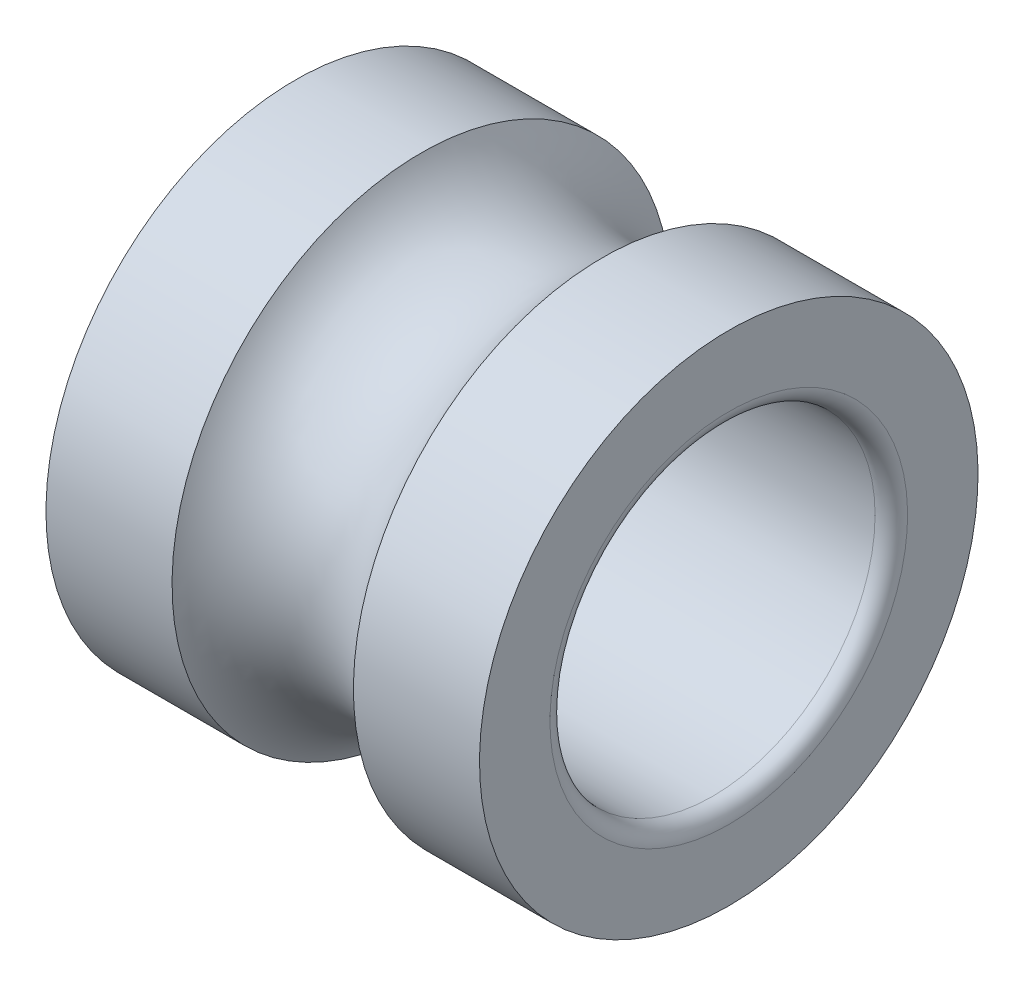
ISO-10303-21;
HEADER;
FILE_DESCRIPTION(('STEP AP214'),'2;1');
FILE_NAME('part.step','',(''),(''),'','','');
FILE_SCHEMA(('AUTOMOTIVE_DESIGN { 1 0 10303 214 1 1 1 1 }'));
ENDSEC;
DATA;
#1=APPLICATION_CONTEXT('core data for automotive mechanical design processes');
#2=APPLICATION_PROTOCOL_DEFINITION('international standard','automotive_design',2000,#1);
#3=PRODUCT_CONTEXT('',#1,'mechanical');
#4=PRODUCT('Part','Part','',(#3));
#5=PRODUCT_RELATED_PRODUCT_CATEGORY('part','',(#4));
#6=PRODUCT_DEFINITION_FORMATION('','',#4);
#7=PRODUCT_DEFINITION_CONTEXT('part definition',#1,'design');
#8=PRODUCT_DEFINITION('design','',#6,#7);
#9=PRODUCT_DEFINITION_SHAPE('','',#8);
#10=(LENGTH_UNIT() NAMED_UNIT(*) SI_UNIT(.MILLI.,.METRE.));
#11=(NAMED_UNIT(*) PLANE_ANGLE_UNIT() SI_UNIT($,.RADIAN.));
#12=(NAMED_UNIT(*) SI_UNIT($,.STERADIAN.) SOLID_ANGLE_UNIT());
#13=UNCERTAINTY_MEASURE_WITH_UNIT(LENGTH_MEASURE(1.E-05),#10,'distance_accuracy_value','');
#14=(GEOMETRIC_REPRESENTATION_CONTEXT(3) GLOBAL_UNCERTAINTY_ASSIGNED_CONTEXT((#13)) GLOBAL_UNIT_ASSIGNED_CONTEXT((#10,
#11,#12)) REPRESENTATION_CONTEXT('',''));
#15=CARTESIAN_POINT('',(0.,0.,0.));
#16=DIRECTION('',(0.,0.,1.));
#17=DIRECTION('',(1.,0.,0.));
#18=AXIS2_PLACEMENT_3D('',#15,#16,#17);
#19=CARTESIAN_POINT('',(0.150000000000002,0.,0.));
#20=DIRECTION('',(-1.,0.,0.));
#21=DIRECTION('',(0.,-1.,0.));
#22=AXIS2_PLACEMENT_3D('',#19,#20,#21);
#23=TOROIDAL_SURFACE('',#22,1.65,0.15);
#24=CARTESIAN_POINT('',(0.150000000000002,0.,0.));
#25=DIRECTION('',(-1.,0.,0.));
#26=DIRECTION('',(0.,-1.,0.));
#27=AXIS2_PLACEMENT_3D('',#24,#25,#26);
#28=CIRCLE('',#27,1.5);
#29=CARTESIAN_POINT('',(0.150000000000003,-1.5,0.));
#30=VERTEX_POINT('',#29);
#31=EDGE_CURVE('E10',#30,#30,#28,.T.);
#32=ORIENTED_EDGE('',*,*,#31,.F.);
#33=EDGE_LOOP('',(#32));
#34=FACE_BOUND('',#33,.T.);
#35=CARTESIAN_POINT('',(0.,0.,0.));
#36=DIRECTION('',(-1.,0.,0.));
#37=DIRECTION('',(0.,-1.,0.));
#38=AXIS2_PLACEMENT_3D('',#35,#36,#37);
#39=CIRCLE('',#38,1.65);
#40=CARTESIAN_POINT('',(0.,-1.65,0.));
#41=VERTEX_POINT('',#40);
#42=EDGE_CURVE('E60',#41,#41,#39,.T.);
#43=ORIENTED_EDGE('',*,*,#42,.T.);
#44=EDGE_LOOP('',(#43));
#45=FACE_BOUND('',#44,.T.);
#46=ADVANCED_FACE('F32',(#34,#45),#23,.T.);
#47=CARTESIAN_POINT('',(0.,0.,0.));
#48=DIRECTION('',(-1.,0.,0.));
#49=DIRECTION('',(0.,-1.,0.));
#50=AXIS2_PLACEMENT_3D('',#47,#48,#49);
#51=CYLINDRICAL_SURFACE('',#50,1.5);
#52=CARTESIAN_POINT('',(3.85,0.,0.));
#53=DIRECTION('',(-1.,0.,0.));
#54=DIRECTION('',(0.,-1.,0.));
#55=AXIS2_PLACEMENT_3D('',#52,#53,#54);
#56=CIRCLE('',#55,1.5);
#57=CARTESIAN_POINT('',(3.85,-1.5,0.));
#58=VERTEX_POINT('',#57);
#59=EDGE_CURVE('E38',#58,#58,#56,.T.);
#60=ORIENTED_EDGE('',*,*,#59,.F.);
#61=EDGE_LOOP('',(#60));
#62=FACE_BOUND('',#61,.T.);
#63=ORIENTED_EDGE('',*,*,#31,.T.);
#64=EDGE_LOOP('',(#63));
#65=FACE_BOUND('',#64,.T.);
#66=ADVANCED_FACE('F97',(#62,#65),#51,.F.);
#67=CARTESIAN_POINT('',(3.85,0.,0.));
#68=DIRECTION('',(-1.,0.,0.));
#69=DIRECTION('',(0.,-1.,0.));
#70=AXIS2_PLACEMENT_3D('',#67,#68,#69);
#71=TOROIDAL_SURFACE('',#70,1.65,0.149999999999999);
#72=CARTESIAN_POINT('',(4.,0.,0.));
#73=DIRECTION('',(-1.,0.,0.));
#74=DIRECTION('',(0.,-1.,0.));
#75=AXIS2_PLACEMENT_3D('',#72,#73,#74);
#76=CIRCLE('',#75,1.65);
#77=CARTESIAN_POINT('',(4.,-1.65,0.));
#78=VERTEX_POINT('',#77);
#79=EDGE_CURVE('E42',#78,#78,#76,.T.);
#80=ORIENTED_EDGE('',*,*,#79,.F.);
#81=EDGE_LOOP('',(#80));
#82=FACE_BOUND('',#81,.T.);
#83=ORIENTED_EDGE('',*,*,#59,.T.);
#84=EDGE_LOOP('',(#83));
#85=FACE_BOUND('',#84,.T.);
#86=ADVANCED_FACE('F92',(#82,#85),#71,.T.);
#87=CARTESIAN_POINT('',(4.,2.3,0.));
#88=DIRECTION('',(-1.,0.,0.));
#89=DIRECTION('',(0.,-1.,0.));
#90=AXIS2_PLACEMENT_3D('',#87,#88,#89);
#91=PLANE('',#90);
#92=CARTESIAN_POINT('',(4.,0.,0.));
#93=DIRECTION('',(-1.,0.,0.));
#94=DIRECTION('',(0.,-1.,0.));
#95=AXIS2_PLACEMENT_3D('',#92,#93,#94);
#96=CIRCLE('',#95,2.3);
#97=CARTESIAN_POINT('',(4.,-2.3,0.));
#98=VERTEX_POINT('',#97);
#99=EDGE_CURVE('E46',#98,#98,#96,.T.);
#100=ORIENTED_EDGE('',*,*,#99,.F.);
#101=EDGE_LOOP('',(#100));
#102=FACE_BOUND('',#101,.T.);
#103=ORIENTED_EDGE('',*,*,#79,.T.);
#104=EDGE_LOOP('',(#103));
#105=FACE_BOUND('',#104,.T.);
#106=ADVANCED_FACE('F86',(#102,#105),#91,.F.);
#107=CARTESIAN_POINT('',(0.,0.,0.));
#108=DIRECTION('',(-1.,0.,0.));
#109=DIRECTION('',(0.,-1.,0.));
#110=AXIS2_PLACEMENT_3D('',#107,#108,#109);
#111=CYLINDRICAL_SURFACE('',#110,2.3);
#112=CARTESIAN_POINT('',(2.83666002653408,0.,0.));
#113=DIRECTION('',(-1.,0.,0.));
#114=DIRECTION('',(0.,-1.,0.));
#115=AXIS2_PLACEMENT_3D('',#112,#113,#114);
#116=CIRCLE('',#115,2.3);
#117=CARTESIAN_POINT('',(2.83666002653408,-2.3,0.));
#118=VERTEX_POINT('',#117);
#119=EDGE_CURVE('E51',#118,#118,#116,.T.);
#120=ORIENTED_EDGE('',*,*,#119,.F.);
#121=EDGE_LOOP('',(#120));
#122=FACE_BOUND('',#121,.T.);
#123=ORIENTED_EDGE('',*,*,#99,.T.);
#124=EDGE_LOOP('',(#123));
#125=FACE_BOUND('',#124,.T.);
#126=ADVANCED_FACE('F80',(#122,#125),#111,.T.);
#127=CARTESIAN_POINT('',(2.,0.,0.));
#128=DIRECTION('',(-1.,0.,0.));
#129=DIRECTION('',(0.,-1.,0.));
#130=AXIS2_PLACEMENT_3D('',#127,#128,#129);
#131=TOROIDAL_SURFACE('',#130,2.75,0.95);
#132=CARTESIAN_POINT('',(1.16333997346593,0.,0.));
#133=DIRECTION('',(-1.,0.,0.));
#134=DIRECTION('',(0.,-1.,0.));
#135=AXIS2_PLACEMENT_3D('',#132,#133,#134);
#136=CIRCLE('',#135,2.3);
#137=CARTESIAN_POINT('',(1.16333997346593,-2.3,0.));
#138=VERTEX_POINT('',#137);
#139=EDGE_CURVE('E54',#138,#138,#136,.T.);
#140=ORIENTED_EDGE('',*,*,#139,.F.);
#141=EDGE_LOOP('',(#140));
#142=FACE_BOUND('',#141,.T.);
#143=ORIENTED_EDGE('',*,*,#119,.T.);
#144=EDGE_LOOP('',(#143));
#145=FACE_BOUND('',#144,.T.);
#146=ADVANCED_FACE('F74',(#142,#145),#131,.F.);
#147=CARTESIAN_POINT('',(0.,0.,0.));
#148=DIRECTION('',(-1.,0.,0.));
#149=DIRECTION('',(0.,-1.,0.));
#150=AXIS2_PLACEMENT_3D('',#147,#148,#149);
#151=CYLINDRICAL_SURFACE('',#150,2.3);
#152=CARTESIAN_POINT('',(0.,0.,0.));
#153=DIRECTION('',(-1.,0.,0.));
#154=DIRECTION('',(0.,-1.,0.));
#155=AXIS2_PLACEMENT_3D('',#152,#153,#154);
#156=CIRCLE('',#155,2.3);
#157=CARTESIAN_POINT('',(0.,-2.3,0.));
#158=VERTEX_POINT('',#157);
#159=EDGE_CURVE('E57',#158,#158,#156,.T.);
#160=ORIENTED_EDGE('',*,*,#159,.F.);
#161=EDGE_LOOP('',(#160));
#162=FACE_BOUND('',#161,.T.);
#163=ORIENTED_EDGE('',*,*,#139,.T.);
#164=EDGE_LOOP('',(#163));
#165=FACE_BOUND('',#164,.T.);
#166=ADVANCED_FACE('F68',(#162,#165),#151,.T.);
#167=CARTESIAN_POINT('',(0.,2.3,0.));
#168=DIRECTION('',(1.,0.,0.));
#169=DIRECTION('',(0.,1.,0.));
#170=AXIS2_PLACEMENT_3D('',#167,#168,#169);
#171=PLANE('',#170);
#172=ORIENTED_EDGE('',*,*,#42,.F.);
#173=EDGE_LOOP('',(#172));
#174=FACE_BOUND('',#173,.T.);
#175=ORIENTED_EDGE('',*,*,#159,.T.);
#176=EDGE_LOOP('',(#175));
#177=FACE_BOUND('',#176,.T.);
#178=ADVANCED_FACE('F65',(#174,#177),#171,.F.);
#179=CLOSED_SHELL('',(#46,#66,#86,#106,#126,#146,#166,#178));
#180=MANIFOLD_SOLID_BREP('B2',#179);
#181=ADVANCED_BREP_SHAPE_REPRESENTATION('',(#18,#180),#14);
#182=SHAPE_DEFINITION_REPRESENTATION(#9,#181);
ENDSEC;
END-ISO-10303-21;
